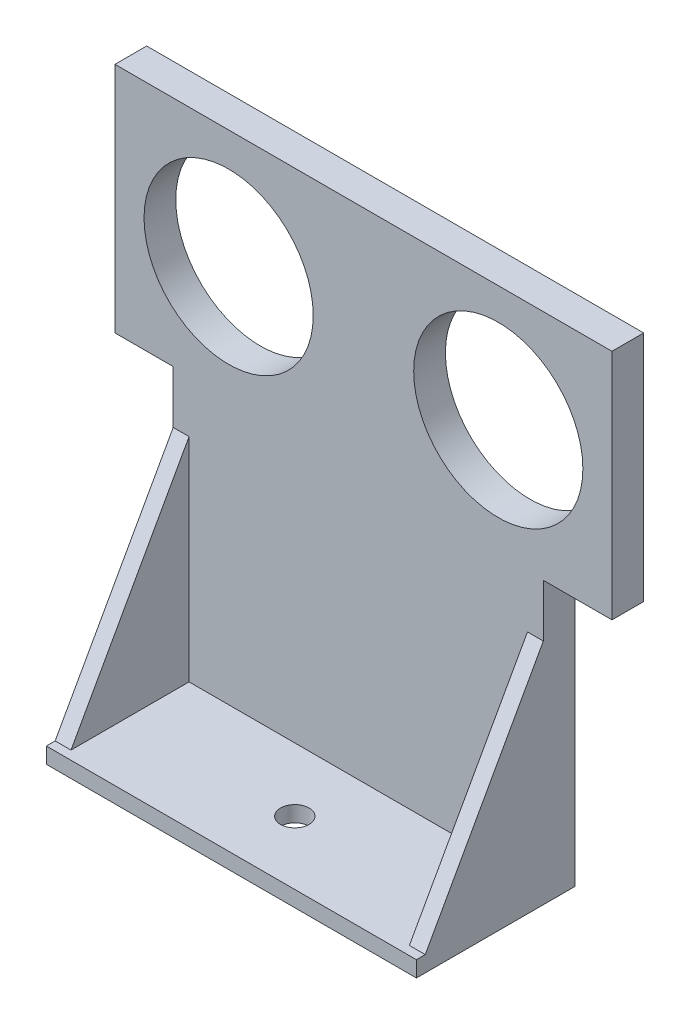
ISO-10303-21;
HEADER;
FILE_DESCRIPTION(('STEP AP214'),'2;1');
FILE_NAME('part.step','',(''),(''),'','','');
FILE_SCHEMA(('AUTOMOTIVE_DESIGN { 1 0 10303 214 1 1 1 1 }'));
ENDSEC;
DATA;
#1=APPLICATION_CONTEXT('core data for automotive mechanical design processes');
#2=APPLICATION_PROTOCOL_DEFINITION('international standard','automotive_design',2000,#1);
#3=PRODUCT_CONTEXT('',#1,'mechanical');
#4=PRODUCT('Part','Part','',(#3));
#5=PRODUCT_RELATED_PRODUCT_CATEGORY('part','',(#4));
#6=PRODUCT_DEFINITION_FORMATION('','',#4);
#7=PRODUCT_DEFINITION_CONTEXT('part definition',#1,'design');
#8=PRODUCT_DEFINITION('design','',#6,#7);
#9=PRODUCT_DEFINITION_SHAPE('','',#8);
#10=(LENGTH_UNIT() NAMED_UNIT(*) SI_UNIT(.MILLI.,.METRE.));
#11=(NAMED_UNIT(*) PLANE_ANGLE_UNIT() SI_UNIT($,.RADIAN.));
#12=(NAMED_UNIT(*) SI_UNIT($,.STERADIAN.) SOLID_ANGLE_UNIT());
#13=UNCERTAINTY_MEASURE_WITH_UNIT(LENGTH_MEASURE(1.E-05),#10,'distance_accuracy_value','');
#14=(GEOMETRIC_REPRESENTATION_CONTEXT(3) GLOBAL_UNCERTAINTY_ASSIGNED_CONTEXT((#13)) GLOBAL_UNIT_ASSIGNED_CONTEXT((#10,
#11,#12)) REPRESENTATION_CONTEXT('',''));
#15=CARTESIAN_POINT('',(0.,0.,0.));
#16=DIRECTION('',(0.,0.,1.));
#17=DIRECTION('',(1.,0.,0.));
#18=AXIS2_PLACEMENT_3D('',#15,#16,#17);
#19=CARTESIAN_POINT('',(-16.,0.,6.));
#20=DIRECTION('',(0.,-1.,0.));
#21=DIRECTION('',(1.,0.,0.));
#22=AXIS2_PLACEMENT_3D('',#19,#20,#21);
#23=PLANE('',#22);
#24=DIRECTION('',(0.,0.,1.));
#25=VECTOR('',#24,1.);
#26=CARTESIAN_POINT('',(-17.5,0.,6.));
#27=LINE('',#26,#25);
#28=CARTESIAN_POINT('',(-17.5,0.,-9.00000000000001));
#29=VERTEX_POINT('',#28);
#30=CARTESIAN_POINT('',(-17.5,0.,6.));
#31=VERTEX_POINT('',#30);
#32=EDGE_CURVE('E316',#29,#31,#27,.T.);
#33=ORIENTED_EDGE('',*,*,#32,.F.);
#34=DIRECTION('',(1.,0.,0.));
#35=VECTOR('',#34,1.);
#36=CARTESIAN_POINT('',(-17.5,0.,-9.00000000000001));
#37=LINE('',#36,#35);
#38=CARTESIAN_POINT('',(17.5,0.,-9.00000000000001));
#39=VERTEX_POINT('',#38);
#40=EDGE_CURVE('E242',#29,#39,#37,.T.);
#41=ORIENTED_EDGE('',*,*,#40,.T.);
#42=DIRECTION('',(0.,0.,-1.));
#43=VECTOR('',#42,1.);
#44=CARTESIAN_POINT('',(17.5,0.,6.));
#45=LINE('',#44,#43);
#46=CARTESIAN_POINT('',(17.5,0.,6.));
#47=VERTEX_POINT('',#46);
#48=EDGE_CURVE('E311',#47,#39,#45,.T.);
#49=ORIENTED_EDGE('',*,*,#48,.F.);
#50=DIRECTION('',(-1.,0.,0.));
#51=VECTOR('',#50,1.);
#52=CARTESIAN_POINT('',(-16.,0.,6.));
#53=LINE('',#52,#51);
#54=EDGE_CURVE('E110',#47,#31,#53,.T.);
#55=ORIENTED_EDGE('',*,*,#54,.T.);
#56=EDGE_LOOP('',(#33,#41,#49,#55));
#57=FACE_BOUND('',#56,.T.);
#58=CARTESIAN_POINT('',(0.,0.,0.));
#59=DIRECTION('',(0.,1.,0.));
#60=DIRECTION('',(0.,0.,1.));
#61=AXIS2_PLACEMENT_3D('',#58,#59,#60);
#62=CIRCLE('',#61,1.35);
#63=CARTESIAN_POINT('',(0.,0.,1.35));
#64=VERTEX_POINT('',#63);
#65=EDGE_CURVE('E369',#64,#64,#62,.T.);
#66=ORIENTED_EDGE('',*,*,#65,.T.);
#67=EDGE_LOOP('',(#66));
#68=FACE_BOUND('',#67,.T.);
#69=ADVANCED_FACE('F102',(#57,#68),#23,.T.);
#70=CARTESIAN_POINT('',(-16.,21.59,-6.));
#71=DIRECTION('',(0.,0.485814790232148,0.87406177675934));
#72=DIRECTION('',(0.,-0.87406177675934,0.485814790232148));
#73=AXIS2_PLACEMENT_3D('',#70,#71,#72);
#74=PLANE('',#73);
#75=DIRECTION('',(-1.,0.,0.));
#76=VECTOR('',#75,1.);
#77=CARTESIAN_POINT('',(-16.,1.5,5.16628068550254));
#78=LINE('',#77,#76);
#79=CARTESIAN_POINT('',(-16.,1.5,5.16628068550254));
#80=VERTEX_POINT('',#79);
#81=CARTESIAN_POINT('',(-17.5,1.5,5.16628068550254));
#82=VERTEX_POINT('',#81);
#83=EDGE_CURVE('E321',#80,#82,#78,.T.);
#84=ORIENTED_EDGE('',*,*,#83,.F.);
#85=DIRECTION('',(0.,0.87406177675934,-0.485814790232148));
#86=VECTOR('',#85,1.);
#87=CARTESIAN_POINT('',(-16.,21.59,-6.));
#88=LINE('',#87,#86);
#89=CARTESIAN_POINT('',(-16.,21.59,-6.));
#90=VERTEX_POINT('',#89);
#91=EDGE_CURVE('E337',#80,#90,#88,.T.);
#92=ORIENTED_EDGE('',*,*,#91,.T.);
#93=DIRECTION('',(-1.,0.,0.));
#94=VECTOR('',#93,1.);
#95=CARTESIAN_POINT('',(-16.,21.59,-6.));
#96=LINE('',#95,#94);
#97=CARTESIAN_POINT('',(-17.5,21.59,-6.));
#98=VERTEX_POINT('',#97);
#99=EDGE_CURVE('E12',#90,#98,#96,.T.);
#100=ORIENTED_EDGE('',*,*,#99,.T.);
#101=DIRECTION('',(0.,0.87406177675934,-0.485814790232148));
#102=VECTOR('',#101,1.);
#103=CARTESIAN_POINT('',(-17.5,21.59,-6.));
#104=LINE('',#103,#102);
#105=EDGE_CURVE('E320',#82,#98,#104,.T.);
#106=ORIENTED_EDGE('',*,*,#105,.F.);
#107=EDGE_LOOP('',(#84,#92,#100,#106));
#108=FACE_BOUND('',#107,.T.);
#109=ADVANCED_FACE('F339',(#108),#74,.T.);
#110=CARTESIAN_POINT('',(-16.,0.,0.));
#111=DIRECTION('',(1.,0.,0.));
#112=DIRECTION('',(0.,1.,0.));
#113=AXIS2_PLACEMENT_3D('',#110,#111,#112);
#114=PLANE('',#113);
#115=DIRECTION('',(0.,0.,1.));
#116=VECTOR('',#115,1.);
#117=CARTESIAN_POINT('',(-16.,1.5,0.));
#118=LINE('',#117,#116);
#119=CARTESIAN_POINT('',(-16.,1.5,-6.));
#120=VERTEX_POINT('',#119);
#121=EDGE_CURVE('E346',#120,#80,#118,.T.);
#122=ORIENTED_EDGE('',*,*,#121,.F.);
#123=DIRECTION('',(0.,-1.,0.));
#124=VECTOR('',#123,1.);
#125=CARTESIAN_POINT('',(-16.,0.,-6.));
#126=LINE('',#125,#124);
#127=EDGE_CURVE('E343',#90,#120,#126,.T.);
#128=ORIENTED_EDGE('',*,*,#127,.F.);
#129=ORIENTED_EDGE('',*,*,#91,.F.);
#130=EDGE_LOOP('',(#122,#128,#129));
#131=FACE_BOUND('',#130,.T.);
#132=ADVANCED_FACE('F345',(#131),#114,.T.);
#133=CARTESIAN_POINT('',(-17.5,0.,0.));
#134=DIRECTION('',(1.,0.,0.));
#135=DIRECTION('',(0.,1.,0.));
#136=AXIS2_PLACEMENT_3D('',#133,#134,#135);
#137=PLANE('',#136);
#138=ORIENTED_EDGE('',*,*,#105,.T.);
#139=DIRECTION('',(0.,1.,0.));
#140=VECTOR('',#139,1.);
#141=CARTESIAN_POINT('',(-17.5,0.,-6.));
#142=LINE('',#141,#140);
#143=CARTESIAN_POINT('',(-17.5,26.57366529,-6.));
#144=VERTEX_POINT('',#143);
#145=EDGE_CURVE('E258',#98,#144,#142,.T.);
#146=ORIENTED_EDGE('',*,*,#145,.T.);
#147=DIRECTION('',(0.,0.,1.));
#148=VECTOR('',#147,1.);
#149=CARTESIAN_POINT('',(-17.5,26.57366529,-9.00000000000001));
#150=LINE('',#149,#148);
#151=CARTESIAN_POINT('',(-17.5,26.57366529,-9.00000000000001));
#152=VERTEX_POINT('',#151);
#153=EDGE_CURVE('E290',#152,#144,#150,.T.);
#154=ORIENTED_EDGE('',*,*,#153,.F.);
#155=DIRECTION('',(0.,1.,0.));
#156=VECTOR('',#155,1.);
#157=CARTESIAN_POINT('',(-17.5,0.,-9.00000000000001));
#158=LINE('',#157,#156);
#159=EDGE_CURVE('E240',#29,#152,#158,.T.);
#160=ORIENTED_EDGE('',*,*,#159,.F.);
#161=ORIENTED_EDGE('',*,*,#32,.T.);
#162=DIRECTION('',(0.,-1.,0.));
#163=VECTOR('',#162,1.);
#164=CARTESIAN_POINT('',(-17.5,1.5,6.));
#165=LINE('',#164,#163);
#166=CARTESIAN_POINT('',(-17.5,1.5,6.));
#167=VERTEX_POINT('',#166);
#168=EDGE_CURVE('E355',#167,#31,#165,.T.);
#169=ORIENTED_EDGE('',*,*,#168,.F.);
#170=DIRECTION('',(0.,0.,-1.));
#171=VECTOR('',#170,1.);
#172=CARTESIAN_POINT('',(-17.5,1.5,6.));
#173=LINE('',#172,#171);
#174=EDGE_CURVE('E334',#167,#82,#173,.T.);
#175=ORIENTED_EDGE('',*,*,#174,.T.);
#176=EDGE_LOOP('',(#138,#146,#154,#160,#161,#169,#175));
#177=FACE_BOUND('',#176,.T.);
#178=ADVANCED_FACE('F324',(#177),#137,.F.);
#179=CARTESIAN_POINT('',(0.,1.5,0.));
#180=DIRECTION('',(0.,1.,0.));
#181=DIRECTION('',(0.,0.,1.));
#182=AXIS2_PLACEMENT_3D('',#179,#180,#181);
#183=PLANE('',#182);
#184=DIRECTION('',(1.,0.,0.));
#185=VECTOR('',#184,1.);
#186=CARTESIAN_POINT('',(0.,1.5,5.16637598499684));
#187=LINE('',#186,#185);
#188=CARTESIAN_POINT('',(16.,1.5,5.16637598499684));
#189=VERTEX_POINT('',#188);
#190=CARTESIAN_POINT('',(17.5,1.5,5.16637598499684));
#191=VERTEX_POINT('',#190);
#192=EDGE_CURVE('E118',#189,#191,#187,.T.);
#193=ORIENTED_EDGE('',*,*,#192,.F.);
#194=DIRECTION('',(0.,0.,1.));
#195=VECTOR('',#194,1.);
#196=CARTESIAN_POINT('',(16.,1.5,0.));
#197=LINE('',#196,#195);
#198=CARTESIAN_POINT('',(16.,1.5,-6.));
#199=VERTEX_POINT('',#198);
#200=EDGE_CURVE('E122',#199,#189,#197,.T.);
#201=ORIENTED_EDGE('',*,*,#200,.F.);
#202=DIRECTION('',(-1.,0.,0.));
#203=VECTOR('',#202,1.);
#204=CARTESIAN_POINT('',(17.5,1.5,-6.));
#205=LINE('',#204,#203);
#206=EDGE_CURVE('E366',#199,#120,#205,.T.);
#207=ORIENTED_EDGE('',*,*,#206,.T.);
#208=ORIENTED_EDGE('',*,*,#121,.T.);
#209=ORIENTED_EDGE('',*,*,#83,.T.);
#210=ORIENTED_EDGE('',*,*,#174,.F.);
#211=DIRECTION('',(-1.,0.,0.));
#212=VECTOR('',#211,1.);
#213=CARTESIAN_POINT('',(17.5,1.5,6.));
#214=LINE('',#213,#212);
#215=CARTESIAN_POINT('',(17.5,1.5,6.));
#216=VERTEX_POINT('',#215);
#217=EDGE_CURVE('E359',#216,#167,#214,.T.);
#218=ORIENTED_EDGE('',*,*,#217,.F.);
#219=DIRECTION('',(0.,0.,-1.));
#220=VECTOR('',#219,1.);
#221=CARTESIAN_POINT('',(17.5,1.5,6.));
#222=LINE('',#221,#220);
#223=EDGE_CURVE('E361',#216,#191,#222,.T.);
#224=ORIENTED_EDGE('',*,*,#223,.T.);
#225=EDGE_LOOP('',(#193,#201,#207,#208,#209,#210,#218,#224));
#226=FACE_BOUND('',#225,.T.);
#227=CARTESIAN_POINT('',(0.,1.5,0.));
#228=DIRECTION('',(0.,1.,0.));
#229=DIRECTION('',(0.,0.,1.));
#230=AXIS2_PLACEMENT_3D('',#227,#228,#229);
#231=CIRCLE('',#230,1.35);
#232=CARTESIAN_POINT('',(0.,1.5,1.35));
#233=VERTEX_POINT('',#232);
#234=EDGE_CURVE('E362',#233,#233,#231,.T.);
#235=ORIENTED_EDGE('',*,*,#234,.F.);
#236=EDGE_LOOP('',(#235));
#237=FACE_BOUND('',#236,.T.);
#238=ADVANCED_FACE('F378',(#226,#237),#183,.T.);
#239=CARTESIAN_POINT('',(17.5,1.5,6.));
#240=DIRECTION('',(-1.,0.,0.));
#241=DIRECTION('',(0.,0.,1.));
#242=AXIS2_PLACEMENT_3D('',#239,#240,#241);
#243=PLANE('',#242);
#244=DIRECTION('',(0.,-1.,0.));
#245=VECTOR('',#244,1.);
#246=CARTESIAN_POINT('',(17.5,1.5,6.));
#247=LINE('',#246,#245);
#248=EDGE_CURVE('E357',#216,#47,#247,.T.);
#249=ORIENTED_EDGE('',*,*,#248,.T.);
#250=ORIENTED_EDGE('',*,*,#48,.T.);
#251=DIRECTION('',(0.,1.,0.));
#252=VECTOR('',#251,1.);
#253=CARTESIAN_POINT('',(17.5,0.,-9.00000000000001));
#254=LINE('',#253,#252);
#255=CARTESIAN_POINT('',(17.5,26.57366529,-9.00000000000001));
#256=VERTEX_POINT('',#255);
#257=EDGE_CURVE('E245',#39,#256,#254,.T.);
#258=ORIENTED_EDGE('',*,*,#257,.T.);
#259=DIRECTION('',(0.,0.,1.));
#260=VECTOR('',#259,1.);
#261=CARTESIAN_POINT('',(17.5,26.57366529,-9.00000000000001));
#262=LINE('',#261,#260);
#263=CARTESIAN_POINT('',(17.5,26.57366529,-6.));
#264=VERTEX_POINT('',#263);
#265=EDGE_CURVE('E285',#256,#264,#262,.T.);
#266=ORIENTED_EDGE('',*,*,#265,.T.);
#267=DIRECTION('',(0.,1.,0.));
#268=VECTOR('',#267,1.);
#269=CARTESIAN_POINT('',(17.5,0.,-6.));
#270=LINE('',#269,#268);
#271=CARTESIAN_POINT('',(17.5,21.5924681583601,-6.));
#272=VERTEX_POINT('',#271);
#273=EDGE_CURVE('E231',#272,#264,#270,.T.);
#274=ORIENTED_EDGE('',*,*,#273,.F.);
#275=DIRECTION('',(0.,-0.874085356937327,0.485772363137041));
#276=VECTOR('',#275,1.);
#277=CARTESIAN_POINT('',(17.5,21.5924681583601,-6.));
#278=LINE('',#277,#276);
#279=EDGE_CURVE('E270',#272,#191,#278,.T.);
#280=ORIENTED_EDGE('',*,*,#279,.T.);
#281=ORIENTED_EDGE('',*,*,#223,.F.);
#282=EDGE_LOOP('',(#249,#250,#258,#266,#274,#280,#281));
#283=FACE_BOUND('',#282,.T.);
#284=ADVANCED_FACE('F309',(#283),#243,.F.);
#285=CARTESIAN_POINT('',(17.5,1.5,6.));
#286=DIRECTION('',(0.,0.,1.));
#287=DIRECTION('',(1.,0.,0.));
#288=AXIS2_PLACEMENT_3D('',#285,#286,#287);
#289=PLANE('',#288);
#290=ORIENTED_EDGE('',*,*,#54,.F.);
#291=ORIENTED_EDGE('',*,*,#248,.F.);
#292=ORIENTED_EDGE('',*,*,#217,.T.);
#293=ORIENTED_EDGE('',*,*,#168,.T.);
#294=EDGE_LOOP('',(#290,#291,#292,#293));
#295=FACE_BOUND('',#294,.T.);
#296=ADVANCED_FACE('F382',(#295),#289,.T.);
#297=CARTESIAN_POINT('',(0.,1.5,0.));
#298=DIRECTION('',(0.,-1.,0.));
#299=DIRECTION('',(0.,0.,-1.));
#300=AXIS2_PLACEMENT_3D('',#297,#298,#299);
#301=CYLINDRICAL_SURFACE('',#300,1.35);
#302=ORIENTED_EDGE('',*,*,#234,.T.);
#303=EDGE_LOOP('',(#302));
#304=FACE_BOUND('',#303,.T.);
#305=ORIENTED_EDGE('',*,*,#65,.F.);
#306=EDGE_LOOP('',(#305));
#307=FACE_BOUND('',#306,.T.);
#308=ADVANCED_FACE('F384',(#304,#307),#301,.F.);
#309=CARTESIAN_POINT('',(16.,21.5924681583601,-6.));
#310=DIRECTION('',(0.,0.485772363137041,0.874085356937327));
#311=DIRECTION('',(0.,-0.874085356937327,0.485772363137041));
#312=AXIS2_PLACEMENT_3D('',#309,#310,#311);
#313=PLANE('',#312);
#314=DIRECTION('',(0.,-0.874085356937327,0.485772363137041));
#315=VECTOR('',#314,1.);
#316=CARTESIAN_POINT('',(16.,21.5924681583601,-6.));
#317=LINE('',#316,#315);
#318=CARTESIAN_POINT('',(16.,21.5924681583601,-6.));
#319=VERTEX_POINT('',#318);
#320=EDGE_CURVE('E269',#319,#189,#317,.T.);
#321=ORIENTED_EDGE('',*,*,#320,.T.);
#322=ORIENTED_EDGE('',*,*,#192,.T.);
#323=ORIENTED_EDGE('',*,*,#279,.F.);
#324=DIRECTION('',(1.,0.,0.));
#325=VECTOR('',#324,1.);
#326=CARTESIAN_POINT('',(16.,21.5924681583601,-6.));
#327=LINE('',#326,#325);
#328=EDGE_CURVE('E273',#319,#272,#327,.T.);
#329=ORIENTED_EDGE('',*,*,#328,.F.);
#330=EDGE_LOOP('',(#321,#322,#323,#329));
#331=FACE_BOUND('',#330,.T.);
#332=ADVANCED_FACE('F377',(#331),#313,.T.);
#333=CARTESIAN_POINT('',(16.,0.,0.));
#334=DIRECTION('',(-1.,0.,0.));
#335=DIRECTION('',(0.,0.,1.));
#336=AXIS2_PLACEMENT_3D('',#333,#334,#335);
#337=PLANE('',#336);
#338=DIRECTION('',(0.,1.,0.));
#339=VECTOR('',#338,1.);
#340=CARTESIAN_POINT('',(16.,0.,-6.));
#341=LINE('',#340,#339);
#342=EDGE_CURVE('E266',#199,#319,#341,.T.);
#343=ORIENTED_EDGE('',*,*,#342,.F.);
#344=ORIENTED_EDGE('',*,*,#200,.T.);
#345=ORIENTED_EDGE('',*,*,#320,.F.);
#346=EDGE_LOOP('',(#343,#344,#345));
#347=FACE_BOUND('',#346,.T.);
#348=ADVANCED_FACE('F376',(#347),#337,.T.);
#349=CARTESIAN_POINT('',(0.,0.,-9.00000000000001));
#350=DIRECTION('',(0.,0.,1.));
#351=DIRECTION('',(1.,0.,0.));
#352=AXIS2_PLACEMENT_3D('',#349,#350,#351);
#353=PLANE('',#352);
#354=CARTESIAN_POINT('',(-12.2598127408108,37.3745989134033,-9.00000000000001));
#355=DIRECTION('',(0.,0.,1.));
#356=DIRECTION('',(1.,0.,0.));
#357=AXIS2_PLACEMENT_3D('',#354,#355,#356);
#358=CIRCLE('',#357,8.);
#359=CARTESIAN_POINT('',(-4.25981274081084,37.3745989134033,-9.00000000000001));
#360=VERTEX_POINT('',#359);
#361=EDGE_CURVE('E251',#360,#360,#358,.T.);
#362=ORIENTED_EDGE('',*,*,#361,.T.);
#363=EDGE_LOOP('',(#362));
#364=FACE_BOUND('',#363,.T.);
#365=DIRECTION('',(0.,1.,0.));
#366=VECTOR('',#365,1.);
#367=CARTESIAN_POINT('',(23.9901872591891,26.57366529,-9.00000000000001));
#368=LINE('',#367,#366);
#369=CARTESIAN_POINT('',(23.9901872591891,26.57366529,-9.00000000000001));
#370=VERTEX_POINT('',#369);
#371=CARTESIAN_POINT('',(23.9901872591891,48.57366529,-9.00000000000001));
#372=VERTEX_POINT('',#371);
#373=EDGE_CURVE('E220',#370,#372,#368,.T.);
#374=ORIENTED_EDGE('',*,*,#373,.F.);
#375=DIRECTION('',(-1.,0.,0.));
#376=VECTOR('',#375,1.);
#377=CARTESIAN_POINT('',(23.9901872591891,26.57366529,-9.00000000000001));
#378=LINE('',#377,#376);
#379=EDGE_CURVE('E214',#370,#256,#378,.T.);
#380=ORIENTED_EDGE('',*,*,#379,.T.);
#381=ORIENTED_EDGE('',*,*,#257,.F.);
#382=ORIENTED_EDGE('',*,*,#40,.F.);
#383=ORIENTED_EDGE('',*,*,#159,.T.);
#384=DIRECTION('',(-1.,0.,0.));
#385=VECTOR('',#384,1.);
#386=CARTESIAN_POINT('',(-17.5,26.57366529,-9.00000000000001));
#387=LINE('',#386,#385);
#388=CARTESIAN_POINT('',(-23.0098127408109,26.57366529,-9.00000000000001));
#389=VERTEX_POINT('',#388);
#390=EDGE_CURVE('E238',#152,#389,#387,.T.);
#391=ORIENTED_EDGE('',*,*,#390,.T.);
#392=DIRECTION('',(0.,1.,0.));
#393=VECTOR('',#392,1.);
#394=CARTESIAN_POINT('',(-23.0098127408109,26.57366529,-9.00000000000001));
#395=LINE('',#394,#393);
#396=CARTESIAN_POINT('',(-23.0098127408109,48.57366529,-9.00000000000001));
#397=VERTEX_POINT('',#396);
#398=EDGE_CURVE('E222',#389,#397,#395,.T.);
#399=ORIENTED_EDGE('',*,*,#398,.T.);
#400=DIRECTION('',(-1.,0.,0.));
#401=VECTOR('',#400,1.);
#402=CARTESIAN_POINT('',(23.9901872591891,48.57366529,-9.00000000000001));
#403=LINE('',#402,#401);
#404=EDGE_CURVE('E206',#372,#397,#403,.T.);
#405=ORIENTED_EDGE('',*,*,#404,.F.);
#406=EDGE_LOOP('',(#374,#380,#381,#382,#383,#391,#399,#405));
#407=FACE_BOUND('',#406,.T.);
#408=CARTESIAN_POINT('',(13.2401872591891,37.57366529,-9.00000000000001));
#409=DIRECTION('',(0.,0.,-1.));
#410=DIRECTION('',(-1.,0.,0.));
#411=AXIS2_PLACEMENT_3D('',#408,#409,#410);
#412=CIRCLE('',#411,8.);
#413=CARTESIAN_POINT('',(5.24018725918915,37.57366529,-9.00000000000001));
#414=VERTEX_POINT('',#413);
#415=EDGE_CURVE('E441',#414,#414,#412,.T.);
#416=ORIENTED_EDGE('',*,*,#415,.F.);
#417=EDGE_LOOP('',(#416));
#418=FACE_BOUND('',#417,.T.);
#419=ADVANCED_FACE('F218',(#364,#407,#418),#353,.F.);
#420=CARTESIAN_POINT('',(0.,0.,-6.));
#421=DIRECTION('',(0.,0.,1.));
#422=DIRECTION('',(1.,0.,0.));
#423=AXIS2_PLACEMENT_3D('',#420,#421,#422);
#424=PLANE('',#423);
#425=ORIENTED_EDGE('',*,*,#342,.T.);
#426=ORIENTED_EDGE('',*,*,#328,.T.);
#427=ORIENTED_EDGE('',*,*,#273,.T.);
#428=DIRECTION('',(-1.,0.,0.));
#429=VECTOR('',#428,1.);
#430=CARTESIAN_POINT('',(23.9901872591891,26.57366529,-6.));
#431=LINE('',#430,#429);
#432=CARTESIAN_POINT('',(23.9901872591891,26.57366529,-6.));
#433=VERTEX_POINT('',#432);
#434=EDGE_CURVE('E228',#433,#264,#431,.T.);
#435=ORIENTED_EDGE('',*,*,#434,.F.);
#436=DIRECTION('',(0.,1.,0.));
#437=VECTOR('',#436,1.);
#438=CARTESIAN_POINT('',(23.9901872591891,26.57366529,-6.));
#439=LINE('',#438,#437);
#440=CARTESIAN_POINT('',(23.9901872591891,48.57366529,-6.));
#441=VERTEX_POINT('',#440);
#442=EDGE_CURVE('E249',#433,#441,#439,.T.);
#443=ORIENTED_EDGE('',*,*,#442,.T.);
#444=DIRECTION('',(-1.,0.,0.));
#445=VECTOR('',#444,1.);
#446=CARTESIAN_POINT('',(23.9901872591891,48.57366529,-6.));
#447=LINE('',#446,#445);
#448=CARTESIAN_POINT('',(-23.0098127408109,48.57366529,-6.));
#449=VERTEX_POINT('',#448);
#450=EDGE_CURVE('E208',#441,#449,#447,.T.);
#451=ORIENTED_EDGE('',*,*,#450,.T.);
#452=DIRECTION('',(0.,1.,0.));
#453=VECTOR('',#452,1.);
#454=CARTESIAN_POINT('',(-23.0098127408109,26.57366529,-6.));
#455=LINE('',#454,#453);
#456=CARTESIAN_POINT('',(-23.0098127408109,26.57366529,-6.));
#457=VERTEX_POINT('',#456);
#458=EDGE_CURVE('E253',#457,#449,#455,.T.);
#459=ORIENTED_EDGE('',*,*,#458,.F.);
#460=DIRECTION('',(-1.,0.,0.));
#461=VECTOR('',#460,1.);
#462=CARTESIAN_POINT('',(-17.5,26.57366529,-6.));
#463=LINE('',#462,#461);
#464=EDGE_CURVE('E256',#144,#457,#463,.T.);
#465=ORIENTED_EDGE('',*,*,#464,.F.);
#466=ORIENTED_EDGE('',*,*,#145,.F.);
#467=ORIENTED_EDGE('',*,*,#99,.F.);
#468=ORIENTED_EDGE('',*,*,#127,.T.);
#469=ORIENTED_EDGE('',*,*,#206,.F.);
#470=EDGE_LOOP('',(#425,#426,#427,#435,#443,#451,#459,#465,#466,#467,#468,#469));
#471=FACE_BOUND('',#470,.T.);
#472=CARTESIAN_POINT('',(-12.2598127408108,37.3745989134033,-6.));
#473=DIRECTION('',(0.,0.,1.));
#474=DIRECTION('',(1.,0.,0.));
#475=AXIS2_PLACEMENT_3D('',#472,#473,#474);
#476=CIRCLE('',#475,8.);
#477=CARTESIAN_POINT('',(-4.25981274081084,37.3745989134033,-6.));
#478=VERTEX_POINT('',#477);
#479=EDGE_CURVE('E234',#478,#478,#476,.T.);
#480=ORIENTED_EDGE('',*,*,#479,.F.);
#481=EDGE_LOOP('',(#480));
#482=FACE_BOUND('',#481,.T.);
#483=CARTESIAN_POINT('',(13.2401872591891,37.57366529,-6.));
#484=DIRECTION('',(0.,0.,-1.));
#485=DIRECTION('',(-1.,0.,0.));
#486=AXIS2_PLACEMENT_3D('',#483,#484,#485);
#487=CIRCLE('',#486,8.);
#488=CARTESIAN_POINT('',(5.24018725918915,37.57366529,-6.));
#489=VERTEX_POINT('',#488);
#490=EDGE_CURVE('E444',#489,#489,#487,.T.);
#491=ORIENTED_EDGE('',*,*,#490,.T.);
#492=EDGE_LOOP('',(#491));
#493=FACE_BOUND('',#492,.T.);
#494=ADVANCED_FACE('F303',(#471,#482,#493),#424,.T.);
#495=CARTESIAN_POINT('',(23.9901872591891,26.57366529,-9.00000000000001));
#496=DIRECTION('',(1.,0.,0.));
#497=DIRECTION('',(0.,0.,-1.));
#498=AXIS2_PLACEMENT_3D('',#495,#496,#497);
#499=PLANE('',#498);
#500=ORIENTED_EDGE('',*,*,#442,.F.);
#501=DIRECTION('',(0.,0.,1.));
#502=VECTOR('',#501,1.);
#503=CARTESIAN_POINT('',(23.9901872591891,26.57366529,-9.00000000000001));
#504=LINE('',#503,#502);
#505=EDGE_CURVE('E226',#370,#433,#504,.T.);
#506=ORIENTED_EDGE('',*,*,#505,.F.);
#507=ORIENTED_EDGE('',*,*,#373,.T.);
#508=DIRECTION('',(0.,0.,1.));
#509=VECTOR('',#508,1.);
#510=CARTESIAN_POINT('',(23.9901872591891,48.57366529,-9.00000000000001));
#511=LINE('',#510,#509);
#512=EDGE_CURVE('E203',#372,#441,#511,.T.);
#513=ORIENTED_EDGE('',*,*,#512,.T.);
#514=EDGE_LOOP('',(#500,#506,#507,#513));
#515=FACE_BOUND('',#514,.T.);
#516=ADVANCED_FACE('F225',(#515),#499,.T.);
#517=CARTESIAN_POINT('',(23.9901872591891,26.57366529,-9.00000000000001));
#518=DIRECTION('',(0.,1.,0.));
#519=DIRECTION('',(0.,0.,1.));
#520=AXIS2_PLACEMENT_3D('',#517,#518,#519);
#521=PLANE('',#520);
#522=ORIENTED_EDGE('',*,*,#434,.T.);
#523=ORIENTED_EDGE('',*,*,#265,.F.);
#524=ORIENTED_EDGE('',*,*,#379,.F.);
#525=ORIENTED_EDGE('',*,*,#505,.T.);
#526=EDGE_LOOP('',(#522,#523,#524,#525));
#527=FACE_BOUND('',#526,.T.);
#528=ADVANCED_FACE('F306',(#527),#521,.F.);
#529=CARTESIAN_POINT('',(-17.5,26.57366529,-9.00000000000001));
#530=DIRECTION('',(0.,1.,0.));
#531=DIRECTION('',(0.,0.,1.));
#532=AXIS2_PLACEMENT_3D('',#529,#530,#531);
#533=PLANE('',#532);
#534=ORIENTED_EDGE('',*,*,#464,.T.);
#535=DIRECTION('',(0.,0.,1.));
#536=VECTOR('',#535,1.);
#537=CARTESIAN_POINT('',(-23.0098127408109,26.57366529,-9.00000000000001));
#538=LINE('',#537,#536);
#539=EDGE_CURVE('E295',#389,#457,#538,.T.);
#540=ORIENTED_EDGE('',*,*,#539,.F.);
#541=ORIENTED_EDGE('',*,*,#390,.F.);
#542=ORIENTED_EDGE('',*,*,#153,.T.);
#543=EDGE_LOOP('',(#534,#540,#541,#542));
#544=FACE_BOUND('',#543,.T.);
#545=ADVANCED_FACE('F327',(#544),#533,.F.);
#546=CARTESIAN_POINT('',(-23.0098127408109,26.57366529,-9.00000000000001));
#547=DIRECTION('',(1.,0.,0.));
#548=DIRECTION('',(0.,0.,-1.));
#549=AXIS2_PLACEMENT_3D('',#546,#547,#548);
#550=PLANE('',#549);
#551=ORIENTED_EDGE('',*,*,#458,.T.);
#552=DIRECTION('',(0.,0.,1.));
#553=VECTOR('',#552,1.);
#554=CARTESIAN_POINT('',(-23.0098127408109,48.57366529,-9.00000000000001));
#555=LINE('',#554,#553);
#556=EDGE_CURVE('E213',#397,#449,#555,.T.);
#557=ORIENTED_EDGE('',*,*,#556,.F.);
#558=ORIENTED_EDGE('',*,*,#398,.F.);
#559=ORIENTED_EDGE('',*,*,#539,.T.);
#560=EDGE_LOOP('',(#551,#557,#558,#559));
#561=FACE_BOUND('',#560,.T.);
#562=ADVANCED_FACE('F299',(#561),#550,.F.);
#563=CARTESIAN_POINT('',(23.9901872591891,48.57366529,-9.00000000000001));
#564=DIRECTION('',(0.,1.,0.));
#565=DIRECTION('',(0.,0.,1.));
#566=AXIS2_PLACEMENT_3D('',#563,#564,#565);
#567=PLANE('',#566);
#568=ORIENTED_EDGE('',*,*,#450,.F.);
#569=ORIENTED_EDGE('',*,*,#512,.F.);
#570=ORIENTED_EDGE('',*,*,#404,.T.);
#571=ORIENTED_EDGE('',*,*,#556,.T.);
#572=EDGE_LOOP('',(#568,#569,#570,#571));
#573=FACE_BOUND('',#572,.T.);
#574=ADVANCED_FACE('F205',(#573),#567,.T.);
#575=CARTESIAN_POINT('',(-12.2598127408108,37.3745989134033,-9.00000000000001));
#576=DIRECTION('',(0.,0.,1.));
#577=DIRECTION('',(1.,0.,0.));
#578=AXIS2_PLACEMENT_3D('',#575,#576,#577);
#579=CYLINDRICAL_SURFACE('',#578,8.);
#580=ORIENTED_EDGE('',*,*,#361,.F.);
#581=EDGE_LOOP('',(#580));
#582=FACE_BOUND('',#581,.T.);
#583=ORIENTED_EDGE('',*,*,#479,.T.);
#584=EDGE_LOOP('',(#583));
#585=FACE_BOUND('',#584,.T.);
#586=ADVANCED_FACE('F418',(#582,#585),#579,.F.);
#587=CARTESIAN_POINT('',(13.2401872591891,37.57366529,-9.00000000000001));
#588=DIRECTION('',(0.,0.,1.));
#589=DIRECTION('',(1.,0.,0.));
#590=AXIS2_PLACEMENT_3D('',#587,#588,#589);
#591=CYLINDRICAL_SURFACE('',#590,8.);
#592=ORIENTED_EDGE('',*,*,#415,.T.);
#593=EDGE_LOOP('',(#592));
#594=FACE_BOUND('',#593,.T.);
#595=ORIENTED_EDGE('',*,*,#490,.F.);
#596=EDGE_LOOP('',(#595));
#597=FACE_BOUND('',#596,.T.);
#598=ADVANCED_FACE('F432',(#594,#597),#591,.F.);
#599=CLOSED_SHELL('',(#69,#109,#132,#178,#238,#284,#296,#308,#332,#348,#419,#494,#516,#528,#545,
#562,#574,#586,#598));
#600=MANIFOLD_SOLID_BREP('B2',#599);
#601=ADVANCED_BREP_SHAPE_REPRESENTATION('',(#18,#600),#14);
#602=SHAPE_DEFINITION_REPRESENTATION(#9,#601);
ENDSEC;
END-ISO-10303-21;
